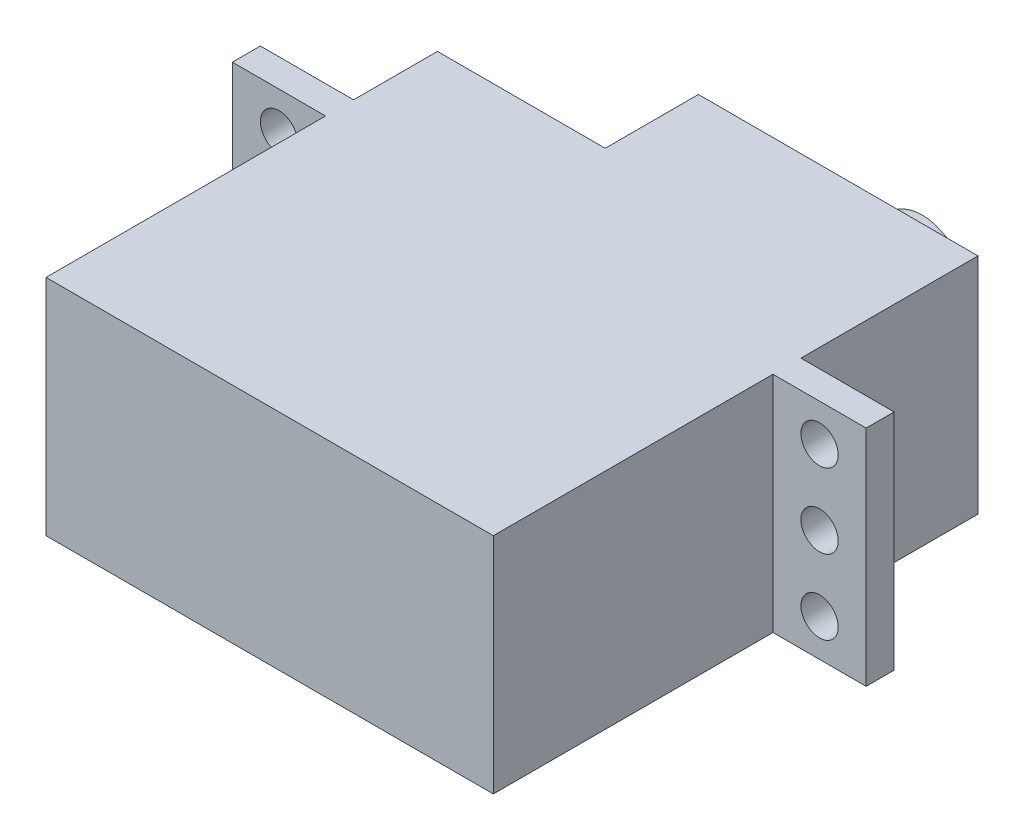
ISO-10303-21;
HEADER;
FILE_DESCRIPTION(('STEP AP214'),'2;1');
FILE_NAME('part.step','',(''),(''),'','','');
FILE_SCHEMA(('AUTOMOTIVE_DESIGN { 1 0 10303 214 1 1 1 1 }'));
ENDSEC;
DATA;
#1=APPLICATION_CONTEXT('core data for automotive mechanical design processes');
#2=APPLICATION_PROTOCOL_DEFINITION('international standard','automotive_design',2000,#1);
#3=PRODUCT_CONTEXT('',#1,'mechanical');
#4=PRODUCT('Part','Part','',(#3));
#5=PRODUCT_RELATED_PRODUCT_CATEGORY('part','',(#4));
#6=PRODUCT_DEFINITION_FORMATION('','',#4);
#7=PRODUCT_DEFINITION_CONTEXT('part definition',#1,'design');
#8=PRODUCT_DEFINITION('design','',#6,#7);
#9=PRODUCT_DEFINITION_SHAPE('','',#8);
#10=(LENGTH_UNIT() NAMED_UNIT(*) SI_UNIT(.MILLI.,.METRE.));
#11=(NAMED_UNIT(*) PLANE_ANGLE_UNIT() SI_UNIT($,.RADIAN.));
#12=(NAMED_UNIT(*) SI_UNIT($,.STERADIAN.) SOLID_ANGLE_UNIT());
#13=UNCERTAINTY_MEASURE_WITH_UNIT(LENGTH_MEASURE(1.E-05),#10,'distance_accuracy_value','');
#14=(GEOMETRIC_REPRESENTATION_CONTEXT(3) GLOBAL_UNCERTAINTY_ASSIGNED_CONTEXT((#13)) GLOBAL_UNIT_ASSIGNED_CONTEXT((#10,
#11,#12)) REPRESENTATION_CONTEXT('',''));
#15=CARTESIAN_POINT('',(0.,0.,0.));
#16=DIRECTION('',(0.,0.,1.));
#17=DIRECTION('',(1.,0.,0.));
#18=AXIS2_PLACEMENT_3D('',#15,#16,#17);
#19=CARTESIAN_POINT('',(0.,0.,-5.));
#20=DIRECTION('',(0.,0.,-1.));
#21=DIRECTION('',(-1.,0.,0.));
#22=AXIS2_PLACEMENT_3D('',#19,#20,#21);
#23=PLANE('',#22);
#24=DIRECTION('',(0.,-1.,0.));
#25=VECTOR('',#24,1.);
#26=CARTESIAN_POINT('',(24.,0.,-5.));
#27=LINE('',#26,#25);
#28=CARTESIAN_POINT('',(24.,0.,-5.));
#29=VERTEX_POINT('',#28);
#30=CARTESIAN_POINT('',(24.,-12.,-5.));
#31=VERTEX_POINT('',#30);
#32=EDGE_CURVE('E144',#29,#31,#27,.T.);
#33=ORIENTED_EDGE('',*,*,#32,.T.);
#34=DIRECTION('',(-1.,0.,0.));
#35=VECTOR('',#34,1.);
#36=CARTESIAN_POINT('',(24.,-12.,-5.));
#37=LINE('',#36,#35);
#38=CARTESIAN_POINT('',(9.,-12.,-5.));
#39=VERTEX_POINT('',#38);
#40=EDGE_CURVE('E151',#31,#39,#37,.T.);
#41=ORIENTED_EDGE('',*,*,#40,.T.);
#42=DIRECTION('',(0.,1.,0.));
#43=VECTOR('',#42,1.);
#44=CARTESIAN_POINT('',(9.,0.,-5.));
#45=LINE('',#44,#43);
#46=CARTESIAN_POINT('',(9.,0.,-5.));
#47=VERTEX_POINT('',#46);
#48=EDGE_CURVE('E157',#39,#47,#45,.T.);
#49=ORIENTED_EDGE('',*,*,#48,.T.);
#50=DIRECTION('',(1.,0.,0.));
#51=VECTOR('',#50,1.);
#52=CARTESIAN_POINT('',(24.,0.,-5.));
#53=LINE('',#52,#51);
#54=EDGE_CURVE('E162',#47,#29,#53,.T.);
#55=ORIENTED_EDGE('',*,*,#54,.T.);
#56=EDGE_LOOP('',(#33,#41,#49,#55));
#57=FACE_BOUND('',#56,.T.);
#58=CARTESIAN_POINT('',(17.,-6.,-5.));
#59=DIRECTION('',(0.,0.,-1.));
#60=DIRECTION('',(-1.,0.,0.));
#61=AXIS2_PLACEMENT_3D('',#58,#59,#60);
#62=CIRCLE('',#61,2.4);
#63=CARTESIAN_POINT('',(14.6,-6.,-5.));
#64=VERTEX_POINT('',#63);
#65=EDGE_CURVE('E167',#64,#64,#62,.T.);
#66=ORIENTED_EDGE('',*,*,#65,.F.);
#67=EDGE_LOOP('',(#66));
#68=FACE_BOUND('',#67,.T.);
#69=ADVANCED_FACE('F33',(#57,#68),#23,.T.);
#70=CARTESIAN_POINT('',(0.,0.,0.));
#71=DIRECTION('',(0.,0.,1.));
#72=DIRECTION('',(1.,0.,0.));
#73=AXIS2_PLACEMENT_3D('',#70,#71,#72);
#74=PLANE('',#73);
#75=DIRECTION('',(0.,1.,0.));
#76=VECTOR('',#75,1.);
#77=CARTESIAN_POINT('',(9.,0.,0.));
#78=LINE('',#77,#76);
#79=CARTESIAN_POINT('',(9.,-12.,0.));
#80=VERTEX_POINT('',#79);
#81=CARTESIAN_POINT('',(9.,0.,0.));
#82=VERTEX_POINT('',#81);
#83=EDGE_CURVE('E50',#80,#82,#78,.T.);
#84=ORIENTED_EDGE('',*,*,#83,.F.);
#85=DIRECTION('',(1.,0.,0.));
#86=VECTOR('',#85,1.);
#87=CARTESIAN_POINT('',(0.,-12.,0.));
#88=LINE('',#87,#86);
#89=CARTESIAN_POINT('',(0.,-12.,0.));
#90=VERTEX_POINT('',#89);
#91=EDGE_CURVE('E179',#90,#80,#88,.T.);
#92=ORIENTED_EDGE('',*,*,#91,.F.);
#93=DIRECTION('',(0.,-1.,0.));
#94=VECTOR('',#93,1.);
#95=CARTESIAN_POINT('',(0.,0.,0.));
#96=LINE('',#95,#94);
#97=CARTESIAN_POINT('',(0.,0.,0.));
#98=VERTEX_POINT('',#97);
#99=EDGE_CURVE('E264',#98,#90,#96,.T.);
#100=ORIENTED_EDGE('',*,*,#99,.F.);
#101=DIRECTION('',(-1.,0.,0.));
#102=VECTOR('',#101,1.);
#103=CARTESIAN_POINT('',(0.,0.,0.));
#104=LINE('',#103,#102);
#105=EDGE_CURVE('E269',#82,#98,#104,.T.);
#106=ORIENTED_EDGE('',*,*,#105,.F.);
#107=EDGE_LOOP('',(#84,#92,#100,#106));
#108=FACE_BOUND('',#107,.T.);
#109=ADVANCED_FACE('F301',(#108),#74,.F.);
#110=CARTESIAN_POINT('',(0.,0.,21.));
#111=DIRECTION('',(1.,0.,0.));
#112=DIRECTION('',(0.,1.,0.));
#113=AXIS2_PLACEMENT_3D('',#110,#111,#112);
#114=PLANE('',#113);
#115=DIRECTION('',(0.,-1.,0.));
#116=VECTOR('',#115,1.);
#117=CARTESIAN_POINT('',(0.,0.,4.5));
#118=LINE('',#117,#116);
#119=CARTESIAN_POINT('',(0.,0.,4.5));
#120=VERTEX_POINT('',#119);
#121=CARTESIAN_POINT('',(0.,-12.,4.5));
#122=VERTEX_POINT('',#121);
#123=EDGE_CURVE('E262',#120,#122,#118,.T.);
#124=ORIENTED_EDGE('',*,*,#123,.F.);
#125=DIRECTION('',(0.,0.,-1.));
#126=VECTOR('',#125,1.);
#127=CARTESIAN_POINT('',(0.,0.,21.));
#128=LINE('',#127,#126);
#129=EDGE_CURVE('E275',#120,#98,#128,.T.);
#130=ORIENTED_EDGE('',*,*,#129,.T.);
#131=ORIENTED_EDGE('',*,*,#99,.T.);
#132=DIRECTION('',(0.,0.,-1.));
#133=VECTOR('',#132,1.);
#134=CARTESIAN_POINT('',(0.,-12.,21.));
#135=LINE('',#134,#133);
#136=EDGE_CURVE('E42',#122,#90,#135,.T.);
#137=ORIENTED_EDGE('',*,*,#136,.F.);
#138=EDGE_LOOP('',(#124,#130,#131,#137));
#139=FACE_BOUND('',#138,.T.);
#140=ADVANCED_FACE('F299',(#139),#114,.F.);
#141=CARTESIAN_POINT('',(24.,0.,21.));
#142=DIRECTION('',(-1.,0.,0.));
#143=DIRECTION('',(0.,0.,1.));
#144=AXIS2_PLACEMENT_3D('',#141,#142,#143);
#145=PLANE('',#144);
#146=DIRECTION('',(0.,1.,0.));
#147=VECTOR('',#146,1.);
#148=CARTESIAN_POINT('',(24.,0.,4.5));
#149=LINE('',#148,#147);
#150=CARTESIAN_POINT('',(24.,-12.,4.5));
#151=VERTEX_POINT('',#150);
#152=CARTESIAN_POINT('',(24.,0.,4.5));
#153=VERTEX_POINT('',#152);
#154=EDGE_CURVE('E145',#151,#153,#149,.T.);
#155=ORIENTED_EDGE('',*,*,#154,.F.);
#156=DIRECTION('',(0.,0.,-1.));
#157=VECTOR('',#156,1.);
#158=CARTESIAN_POINT('',(24.,-12.,21.));
#159=LINE('',#158,#157);
#160=EDGE_CURVE('E139',#151,#31,#159,.T.);
#161=ORIENTED_EDGE('',*,*,#160,.T.);
#162=ORIENTED_EDGE('',*,*,#32,.F.);
#163=DIRECTION('',(0.,0.,-1.));
#164=VECTOR('',#163,1.);
#165=CARTESIAN_POINT('',(24.,0.,21.));
#166=LINE('',#165,#164);
#167=EDGE_CURVE('E285',#153,#29,#166,.T.);
#168=ORIENTED_EDGE('',*,*,#167,.F.);
#169=EDGE_LOOP('',(#155,#161,#162,#168));
#170=FACE_BOUND('',#169,.T.);
#171=ADVANCED_FACE('F141',(#170),#145,.F.);
#172=CARTESIAN_POINT('',(0.,0.,21.));
#173=VERTEX_POINT('',#172);
#174=CARTESIAN_POINT('',(0.,0.,6.));
#175=VERTEX_POINT('',#174);
#176=EDGE_CURVE('E281',#173,#175,#128,.T.);
#177=ORIENTED_EDGE('',*,*,#176,.T.);
#178=DIRECTION('',(0.,-1.,0.));
#179=VECTOR('',#178,1.);
#180=CARTESIAN_POINT('',(0.,0.,6.));
#181=LINE('',#180,#179);
#182=CARTESIAN_POINT('',(0.,-12.,6.00000000000001));
#183=VERTEX_POINT('',#182);
#184=EDGE_CURVE('E259',#175,#183,#181,.T.);
#185=ORIENTED_EDGE('',*,*,#184,.T.);
#186=CARTESIAN_POINT('',(0.,-12.,21.));
#187=VERTEX_POINT('',#186);
#188=EDGE_CURVE('E11',#187,#183,#135,.T.);
#189=ORIENTED_EDGE('',*,*,#188,.F.);
#190=DIRECTION('',(0.,-1.,0.));
#191=VECTOR('',#190,1.);
#192=CARTESIAN_POINT('',(0.,0.,21.));
#193=LINE('',#192,#191);
#194=EDGE_CURVE('E265',#173,#187,#193,.T.);
#195=ORIENTED_EDGE('',*,*,#194,.F.);
#196=EDGE_LOOP('',(#177,#185,#189,#195));
#197=FACE_BOUND('',#196,.T.);
#198=ADVANCED_FACE('F35',(#197),#114,.F.);
#199=CARTESIAN_POINT('',(0.,-12.,21.));
#200=DIRECTION('',(0.,1.,0.));
#201=DIRECTION('',(0.,0.,1.));
#202=AXIS2_PLACEMENT_3D('',#199,#200,#201);
#203=PLANE('',#202);
#204=ORIENTED_EDGE('',*,*,#188,.T.);
#205=DIRECTION('',(1.,0.,0.));
#206=VECTOR('',#205,1.);
#207=CARTESIAN_POINT('',(-5.,-12.,6.));
#208=LINE('',#207,#206);
#209=CARTESIAN_POINT('',(-5.,-12.,6.));
#210=VERTEX_POINT('',#209);
#211=EDGE_CURVE('E58',#210,#183,#208,.T.);
#212=ORIENTED_EDGE('',*,*,#211,.F.);
#213=DIRECTION('',(0.,0.,1.));
#214=VECTOR('',#213,1.);
#215=CARTESIAN_POINT('',(-5.,-12.,4.5));
#216=LINE('',#215,#214);
#217=CARTESIAN_POINT('',(-5.,-12.,4.5));
#218=VERTEX_POINT('',#217);
#219=EDGE_CURVE('E238',#218,#210,#216,.T.);
#220=ORIENTED_EDGE('',*,*,#219,.F.);
#221=DIRECTION('',(1.,0.,0.));
#222=VECTOR('',#221,1.);
#223=CARTESIAN_POINT('',(-5.,-12.,4.5));
#224=LINE('',#223,#222);
#225=EDGE_CURVE('E228',#218,#122,#224,.T.);
#226=ORIENTED_EDGE('',*,*,#225,.T.);
#227=ORIENTED_EDGE('',*,*,#136,.T.);
#228=ORIENTED_EDGE('',*,*,#91,.T.);
#229=DIRECTION('',(0.,0.,1.));
#230=VECTOR('',#229,1.);
#231=CARTESIAN_POINT('',(9.,-12.,-5.));
#232=LINE('',#231,#230);
#233=EDGE_CURVE('E154',#39,#80,#232,.T.);
#234=ORIENTED_EDGE('',*,*,#233,.F.);
#235=ORIENTED_EDGE('',*,*,#40,.F.);
#236=ORIENTED_EDGE('',*,*,#160,.F.);
#237=CARTESIAN_POINT('',(29.,-12.,4.5));
#238=VERTEX_POINT('',#237);
#239=EDGE_CURVE('E226',#151,#238,#224,.T.);
#240=ORIENTED_EDGE('',*,*,#239,.T.);
#241=DIRECTION('',(0.,0.,1.));
#242=VECTOR('',#241,1.);
#243=CARTESIAN_POINT('',(29.,-12.,4.5));
#244=LINE('',#243,#242);
#245=CARTESIAN_POINT('',(29.,-12.,6.));
#246=VERTEX_POINT('',#245);
#247=EDGE_CURVE('E253',#238,#246,#244,.T.);
#248=ORIENTED_EDGE('',*,*,#247,.T.);
#249=CARTESIAN_POINT('',(24.,-12.,6.));
#250=VERTEX_POINT('',#249);
#251=EDGE_CURVE('E240',#250,#246,#208,.T.);
#252=ORIENTED_EDGE('',*,*,#251,.F.);
#253=CARTESIAN_POINT('',(24.,-12.,21.));
#254=VERTEX_POINT('',#253);
#255=EDGE_CURVE('E147',#254,#250,#159,.T.);
#256=ORIENTED_EDGE('',*,*,#255,.F.);
#257=DIRECTION('',(1.,0.,0.));
#258=VECTOR('',#257,1.);
#259=CARTESIAN_POINT('',(0.,-12.,21.));
#260=LINE('',#259,#258);
#261=EDGE_CURVE('E268',#187,#254,#260,.T.);
#262=ORIENTED_EDGE('',*,*,#261,.F.);
#263=EDGE_LOOP('',(#204,#212,#220,#226,#227,#228,#234,#235,#236,#240,#248,#252,#256,#262));
#264=FACE_BOUND('',#263,.T.);
#265=ADVANCED_FACE('F152',(#264),#203,.F.);
#266=ORIENTED_EDGE('',*,*,#255,.T.);
#267=DIRECTION('',(0.,1.,0.));
#268=VECTOR('',#267,1.);
#269=CARTESIAN_POINT('',(24.,0.,6.));
#270=LINE('',#269,#268);
#271=CARTESIAN_POINT('',(24.,0.,6.00000000000001));
#272=VERTEX_POINT('',#271);
#273=EDGE_CURVE('E250',#250,#272,#270,.T.);
#274=ORIENTED_EDGE('',*,*,#273,.T.);
#275=CARTESIAN_POINT('',(24.,0.,21.));
#276=VERTEX_POINT('',#275);
#277=EDGE_CURVE('E148',#276,#272,#166,.T.);
#278=ORIENTED_EDGE('',*,*,#277,.F.);
#279=DIRECTION('',(0.,1.,0.));
#280=VECTOR('',#279,1.);
#281=CARTESIAN_POINT('',(24.,0.,21.));
#282=LINE('',#281,#280);
#283=EDGE_CURVE('E271',#254,#276,#282,.T.);
#284=ORIENTED_EDGE('',*,*,#283,.F.);
#285=EDGE_LOOP('',(#266,#274,#278,#284));
#286=FACE_BOUND('',#285,.T.);
#287=ADVANCED_FACE('F320',(#286),#145,.F.);
#288=CARTESIAN_POINT('',(0.,0.,21.));
#289=DIRECTION('',(0.,-1.,0.));
#290=DIRECTION('',(0.,0.,-1.));
#291=AXIS2_PLACEMENT_3D('',#288,#289,#290);
#292=PLANE('',#291);
#293=ORIENTED_EDGE('',*,*,#277,.T.);
#294=DIRECTION('',(-1.,0.,0.));
#295=VECTOR('',#294,1.);
#296=CARTESIAN_POINT('',(-5.,0.,6.));
#297=LINE('',#296,#295);
#298=CARTESIAN_POINT('',(29.,0.,6.));
#299=VERTEX_POINT('',#298);
#300=EDGE_CURVE('E227',#299,#272,#297,.T.);
#301=ORIENTED_EDGE('',*,*,#300,.F.);
#302=DIRECTION('',(0.,0.,1.));
#303=VECTOR('',#302,1.);
#304=CARTESIAN_POINT('',(29.,0.,4.5));
#305=LINE('',#304,#303);
#306=CARTESIAN_POINT('',(29.,0.,4.5));
#307=VERTEX_POINT('',#306);
#308=EDGE_CURVE('E251',#307,#299,#305,.T.);
#309=ORIENTED_EDGE('',*,*,#308,.F.);
#310=DIRECTION('',(-1.,0.,0.));
#311=VECTOR('',#310,1.);
#312=CARTESIAN_POINT('',(-5.,0.,4.5));
#313=LINE('',#312,#311);
#314=EDGE_CURVE('E235',#307,#153,#313,.T.);
#315=ORIENTED_EDGE('',*,*,#314,.T.);
#316=ORIENTED_EDGE('',*,*,#167,.T.);
#317=ORIENTED_EDGE('',*,*,#54,.F.);
#318=DIRECTION('',(0.,0.,1.));
#319=VECTOR('',#318,1.);
#320=CARTESIAN_POINT('',(9.,0.,-5.));
#321=LINE('',#320,#319);
#322=EDGE_CURVE('E172',#47,#82,#321,.T.);
#323=ORIENTED_EDGE('',*,*,#322,.T.);
#324=ORIENTED_EDGE('',*,*,#105,.T.);
#325=ORIENTED_EDGE('',*,*,#129,.F.);
#326=CARTESIAN_POINT('',(-5.,0.,4.5));
#327=VERTEX_POINT('',#326);
#328=EDGE_CURVE('E234',#120,#327,#313,.T.);
#329=ORIENTED_EDGE('',*,*,#328,.T.);
#330=DIRECTION('',(0.,0.,1.));
#331=VECTOR('',#330,1.);
#332=CARTESIAN_POINT('',(-5.,0.,4.5));
#333=LINE('',#332,#331);
#334=CARTESIAN_POINT('',(-5.,0.,6.));
#335=VERTEX_POINT('',#334);
#336=EDGE_CURVE('E247',#327,#335,#333,.T.);
#337=ORIENTED_EDGE('',*,*,#336,.T.);
#338=EDGE_CURVE('E245',#175,#335,#297,.T.);
#339=ORIENTED_EDGE('',*,*,#338,.F.);
#340=ORIENTED_EDGE('',*,*,#176,.F.);
#341=DIRECTION('',(-1.,0.,0.));
#342=VECTOR('',#341,1.);
#343=CARTESIAN_POINT('',(0.,0.,21.));
#344=LINE('',#343,#342);
#345=EDGE_CURVE('E273',#276,#173,#344,.T.);
#346=ORIENTED_EDGE('',*,*,#345,.F.);
#347=EDGE_LOOP('',(#293,#301,#309,#315,#316,#317,#323,#324,#325,#329,#337,#339,#340,#346));
#348=FACE_BOUND('',#347,.T.);
#349=ADVANCED_FACE('F311',(#348),#292,.F.);
#350=CARTESIAN_POINT('',(0.,0.,21.));
#351=DIRECTION('',(0.,0.,1.));
#352=DIRECTION('',(1.,0.,0.));
#353=AXIS2_PLACEMENT_3D('',#350,#351,#352);
#354=PLANE('',#353);
#355=ORIENTED_EDGE('',*,*,#194,.T.);
#356=ORIENTED_EDGE('',*,*,#261,.T.);
#357=ORIENTED_EDGE('',*,*,#283,.T.);
#358=ORIENTED_EDGE('',*,*,#345,.T.);
#359=EDGE_LOOP('',(#355,#356,#357,#358));
#360=FACE_BOUND('',#359,.T.);
#361=ADVANCED_FACE('F318',(#360),#354,.T.);
#362=CARTESIAN_POINT('',(29.,0.,4.5));
#363=DIRECTION('',(1.,0.,0.));
#364=DIRECTION('',(0.,1.,0.));
#365=AXIS2_PLACEMENT_3D('',#362,#363,#364);
#366=PLANE('',#365);
#367=DIRECTION('',(0.,1.,0.));
#368=VECTOR('',#367,1.);
#369=CARTESIAN_POINT('',(29.,0.,6.));
#370=LINE('',#369,#368);
#371=EDGE_CURVE('E242',#246,#299,#370,.T.);
#372=ORIENTED_EDGE('',*,*,#371,.F.);
#373=ORIENTED_EDGE('',*,*,#247,.F.);
#374=DIRECTION('',(0.,1.,0.));
#375=VECTOR('',#374,1.);
#376=CARTESIAN_POINT('',(29.,0.,4.5));
#377=LINE('',#376,#375);
#378=EDGE_CURVE('E231',#238,#307,#377,.T.);
#379=ORIENTED_EDGE('',*,*,#378,.T.);
#380=ORIENTED_EDGE('',*,*,#308,.T.);
#381=EDGE_LOOP('',(#372,#373,#379,#380));
#382=FACE_BOUND('',#381,.T.);
#383=ADVANCED_FACE('F327',(#382),#366,.T.);
#384=CARTESIAN_POINT('',(26.5000000000001,-10.,4.5));
#385=DIRECTION('',(0.,0.,1.));
#386=DIRECTION('',(1.,0.,0.));
#387=AXIS2_PLACEMENT_3D('',#384,#385,#386);
#388=CYLINDRICAL_SURFACE('',#387,0.999999999999998);
#389=CARTESIAN_POINT('',(26.5000000000001,-10.,4.5));
#390=DIRECTION('',(0.,0.,1.));
#391=DIRECTION('',(1.,0.,0.));
#392=AXIS2_PLACEMENT_3D('',#389,#390,#391);
#393=CIRCLE('',#392,0.999999999999998);
#394=CARTESIAN_POINT('',(27.5000000000001,-10.,4.5));
#395=VERTEX_POINT('',#394);
#396=EDGE_CURVE('E199',#395,#395,#393,.T.);
#397=ORIENTED_EDGE('',*,*,#396,.F.);
#398=EDGE_LOOP('',(#397));
#399=FACE_BOUND('',#398,.T.);
#400=CARTESIAN_POINT('',(26.5000000000001,-10.,6.));
#401=DIRECTION('',(0.,0.,1.));
#402=DIRECTION('',(1.,0.,0.));
#403=AXIS2_PLACEMENT_3D('',#400,#401,#402);
#404=CIRCLE('',#403,0.999999999999998);
#405=CARTESIAN_POINT('',(27.5000000000001,-10.,6.));
#406=VERTEX_POINT('',#405);
#407=EDGE_CURVE('E196',#406,#406,#404,.T.);
#408=ORIENTED_EDGE('',*,*,#407,.T.);
#409=EDGE_LOOP('',(#408));
#410=FACE_BOUND('',#409,.T.);
#411=ADVANCED_FACE('F366',(#399,#410),#388,.F.);
#412=CARTESIAN_POINT('',(26.5,-6.,4.5));
#413=DIRECTION('',(0.,0.,1.));
#414=DIRECTION('',(1.,0.,0.));
#415=AXIS2_PLACEMENT_3D('',#412,#413,#414);
#416=CYLINDRICAL_SURFACE('',#415,0.999999999999998);
#417=CARTESIAN_POINT('',(26.5,-6.,4.5));
#418=DIRECTION('',(0.,0.,1.));
#419=DIRECTION('',(1.,0.,0.));
#420=AXIS2_PLACEMENT_3D('',#417,#418,#419);
#421=CIRCLE('',#420,0.999999999999998);
#422=CARTESIAN_POINT('',(27.5,-6.,4.5));
#423=VERTEX_POINT('',#422);
#424=EDGE_CURVE('E205',#423,#423,#421,.T.);
#425=ORIENTED_EDGE('',*,*,#424,.F.);
#426=EDGE_LOOP('',(#425));
#427=FACE_BOUND('',#426,.T.);
#428=CARTESIAN_POINT('',(26.5,-6.,6.));
#429=DIRECTION('',(0.,0.,1.));
#430=DIRECTION('',(1.,0.,0.));
#431=AXIS2_PLACEMENT_3D('',#428,#429,#430);
#432=CIRCLE('',#431,0.999999999999998);
#433=CARTESIAN_POINT('',(27.5,-6.,6.));
#434=VERTEX_POINT('',#433);
#435=EDGE_CURVE('E202',#434,#434,#432,.T.);
#436=ORIENTED_EDGE('',*,*,#435,.T.);
#437=EDGE_LOOP('',(#436));
#438=FACE_BOUND('',#437,.T.);
#439=ADVANCED_FACE('F369',(#427,#438),#416,.F.);
#440=CARTESIAN_POINT('',(26.5,-2.,4.5));
#441=DIRECTION('',(0.,0.,1.));
#442=DIRECTION('',(1.,0.,0.));
#443=AXIS2_PLACEMENT_3D('',#440,#441,#442);
#444=CYLINDRICAL_SURFACE('',#443,0.999999999999998);
#445=CARTESIAN_POINT('',(26.5,-2.,4.5));
#446=DIRECTION('',(0.,0.,1.));
#447=DIRECTION('',(1.,0.,0.));
#448=AXIS2_PLACEMENT_3D('',#445,#446,#447);
#449=CIRCLE('',#448,0.999999999999998);
#450=CARTESIAN_POINT('',(27.5,-2.,4.5));
#451=VERTEX_POINT('',#450);
#452=EDGE_CURVE('E211',#451,#451,#449,.T.);
#453=ORIENTED_EDGE('',*,*,#452,.F.);
#454=EDGE_LOOP('',(#453));
#455=FACE_BOUND('',#454,.T.);
#456=CARTESIAN_POINT('',(26.5,-2.,6.));
#457=DIRECTION('',(0.,0.,1.));
#458=DIRECTION('',(1.,0.,0.));
#459=AXIS2_PLACEMENT_3D('',#456,#457,#458);
#460=CIRCLE('',#459,0.999999999999998);
#461=CARTESIAN_POINT('',(27.5,-2.,6.));
#462=VERTEX_POINT('',#461);
#463=EDGE_CURVE('E208',#462,#462,#460,.T.);
#464=ORIENTED_EDGE('',*,*,#463,.T.);
#465=EDGE_LOOP('',(#464));
#466=FACE_BOUND('',#465,.T.);
#467=ADVANCED_FACE('F339',(#455,#466),#444,.F.);
#468=CARTESIAN_POINT('',(0.,0.,6.));
#469=DIRECTION('',(0.,0.,1.));
#470=DIRECTION('',(1.,0.,0.));
#471=AXIS2_PLACEMENT_3D('',#468,#469,#470);
#472=PLANE('',#471);
#473=ORIENTED_EDGE('',*,*,#463,.F.);
#474=EDGE_LOOP('',(#473));
#475=FACE_BOUND('',#474,.T.);
#476=ORIENTED_EDGE('',*,*,#435,.F.);
#477=EDGE_LOOP('',(#476));
#478=FACE_BOUND('',#477,.T.);
#479=ORIENTED_EDGE('',*,*,#407,.F.);
#480=EDGE_LOOP('',(#479));
#481=FACE_BOUND('',#480,.T.);
#482=ORIENTED_EDGE('',*,*,#273,.F.);
#483=ORIENTED_EDGE('',*,*,#251,.T.);
#484=ORIENTED_EDGE('',*,*,#371,.T.);
#485=ORIENTED_EDGE('',*,*,#300,.T.);
#486=EDGE_LOOP('',(#482,#483,#484,#485));
#487=FACE_BOUND('',#486,.T.);
#488=ADVANCED_FACE('F322',(#475,#478,#481,#487),#472,.T.);
#489=CARTESIAN_POINT('',(0.,0.,4.5));
#490=DIRECTION('',(0.,0.,1.));
#491=DIRECTION('',(1.,0.,0.));
#492=AXIS2_PLACEMENT_3D('',#489,#490,#491);
#493=PLANE('',#492);
#494=ORIENTED_EDGE('',*,*,#452,.T.);
#495=EDGE_LOOP('',(#494));
#496=FACE_BOUND('',#495,.T.);
#497=ORIENTED_EDGE('',*,*,#424,.T.);
#498=EDGE_LOOP('',(#497));
#499=FACE_BOUND('',#498,.T.);
#500=ORIENTED_EDGE('',*,*,#396,.T.);
#501=EDGE_LOOP('',(#500));
#502=FACE_BOUND('',#501,.T.);
#503=ORIENTED_EDGE('',*,*,#239,.F.);
#504=ORIENTED_EDGE('',*,*,#154,.T.);
#505=ORIENTED_EDGE('',*,*,#314,.F.);
#506=ORIENTED_EDGE('',*,*,#378,.F.);
#507=EDGE_LOOP('',(#503,#504,#505,#506));
#508=FACE_BOUND('',#507,.T.);
#509=ADVANCED_FACE('F330',(#496,#499,#502,#508),#493,.F.);
#510=CARTESIAN_POINT('',(-2.5,-2.,4.5));
#511=DIRECTION('',(0.,0.,1.));
#512=DIRECTION('',(1.,0.,0.));
#513=AXIS2_PLACEMENT_3D('',#510,#511,#512);
#514=CIRCLE('',#513,1.);
#515=CARTESIAN_POINT('',(-1.5,-2.,4.5));
#516=VERTEX_POINT('',#515);
#517=EDGE_CURVE('E217',#516,#516,#514,.T.);
#518=ORIENTED_EDGE('',*,*,#517,.T.);
#519=EDGE_LOOP('',(#518));
#520=FACE_BOUND('',#519,.T.);
#521=CARTESIAN_POINT('',(-2.49999999999996,-6.,4.5));
#522=DIRECTION('',(0.,0.,1.));
#523=DIRECTION('',(1.,0.,0.));
#524=AXIS2_PLACEMENT_3D('',#521,#522,#523);
#525=CIRCLE('',#524,1.);
#526=CARTESIAN_POINT('',(-1.49999999999996,-6.,4.5));
#527=VERTEX_POINT('',#526);
#528=EDGE_CURVE('E193',#527,#527,#525,.T.);
#529=ORIENTED_EDGE('',*,*,#528,.T.);
#530=EDGE_LOOP('',(#529));
#531=FACE_BOUND('',#530,.T.);
#532=CARTESIAN_POINT('',(-2.49999999999992,-10.,4.5));
#533=DIRECTION('',(0.,0.,1.));
#534=DIRECTION('',(1.,0.,0.));
#535=AXIS2_PLACEMENT_3D('',#532,#533,#534);
#536=CIRCLE('',#535,1.);
#537=CARTESIAN_POINT('',(-1.49999999999992,-10.,4.5));
#538=VERTEX_POINT('',#537);
#539=EDGE_CURVE('E175',#538,#538,#536,.T.);
#540=ORIENTED_EDGE('',*,*,#539,.T.);
#541=EDGE_LOOP('',(#540));
#542=FACE_BOUND('',#541,.T.);
#543=ORIENTED_EDGE('',*,*,#328,.F.);
#544=ORIENTED_EDGE('',*,*,#123,.T.);
#545=ORIENTED_EDGE('',*,*,#225,.F.);
#546=DIRECTION('',(0.,-1.,0.));
#547=VECTOR('',#546,1.);
#548=CARTESIAN_POINT('',(-5.,0.,4.5));
#549=LINE('',#548,#547);
#550=EDGE_CURVE('E223',#327,#218,#549,.T.);
#551=ORIENTED_EDGE('',*,*,#550,.F.);
#552=EDGE_LOOP('',(#543,#544,#545,#551));
#553=FACE_BOUND('',#552,.T.);
#554=ADVANCED_FACE('F305',(#520,#531,#542,#553),#493,.F.);
#555=CARTESIAN_POINT('',(-2.5,-2.,6.));
#556=DIRECTION('',(0.,0.,1.));
#557=DIRECTION('',(1.,0.,0.));
#558=AXIS2_PLACEMENT_3D('',#555,#556,#557);
#559=CIRCLE('',#558,1.);
#560=CARTESIAN_POINT('',(-1.5,-2.,6.));
#561=VERTEX_POINT('',#560);
#562=EDGE_CURVE('E214',#561,#561,#559,.T.);
#563=ORIENTED_EDGE('',*,*,#562,.F.);
#564=EDGE_LOOP('',(#563));
#565=FACE_BOUND('',#564,.T.);
#566=CARTESIAN_POINT('',(-2.49999999999996,-6.,6.));
#567=DIRECTION('',(0.,0.,1.));
#568=DIRECTION('',(1.,0.,0.));
#569=AXIS2_PLACEMENT_3D('',#566,#567,#568);
#570=CIRCLE('',#569,1.);
#571=CARTESIAN_POINT('',(-1.49999999999996,-6.,6.));
#572=VERTEX_POINT('',#571);
#573=EDGE_CURVE('E191',#572,#572,#570,.T.);
#574=ORIENTED_EDGE('',*,*,#573,.F.);
#575=EDGE_LOOP('',(#574));
#576=FACE_BOUND('',#575,.T.);
#577=CARTESIAN_POINT('',(-2.49999999999992,-10.,6.));
#578=DIRECTION('',(0.,0.,1.));
#579=DIRECTION('',(1.,0.,0.));
#580=AXIS2_PLACEMENT_3D('',#577,#578,#579);
#581=CIRCLE('',#580,1.);
#582=CARTESIAN_POINT('',(-1.49999999999992,-10.,6.));
#583=VERTEX_POINT('',#582);
#584=EDGE_CURVE('E185',#583,#583,#581,.T.);
#585=ORIENTED_EDGE('',*,*,#584,.F.);
#586=EDGE_LOOP('',(#585));
#587=FACE_BOUND('',#586,.T.);
#588=ORIENTED_EDGE('',*,*,#184,.F.);
#589=ORIENTED_EDGE('',*,*,#338,.T.);
#590=DIRECTION('',(0.,-1.,0.));
#591=VECTOR('',#590,1.);
#592=CARTESIAN_POINT('',(-5.,0.,6.));
#593=LINE('',#592,#591);
#594=EDGE_CURVE('E220',#335,#210,#593,.T.);
#595=ORIENTED_EDGE('',*,*,#594,.T.);
#596=ORIENTED_EDGE('',*,*,#211,.T.);
#597=EDGE_LOOP('',(#588,#589,#595,#596));
#598=FACE_BOUND('',#597,.T.);
#599=ADVANCED_FACE('F312',(#565,#576,#587,#598),#472,.T.);
#600=CARTESIAN_POINT('',(-5.,0.,4.5));
#601=DIRECTION('',(-1.,0.,0.));
#602=DIRECTION('',(0.,-1.,0.));
#603=AXIS2_PLACEMENT_3D('',#600,#601,#602);
#604=PLANE('',#603);
#605=ORIENTED_EDGE('',*,*,#594,.F.);
#606=ORIENTED_EDGE('',*,*,#336,.F.);
#607=ORIENTED_EDGE('',*,*,#550,.T.);
#608=ORIENTED_EDGE('',*,*,#219,.T.);
#609=EDGE_LOOP('',(#605,#606,#607,#608));
#610=FACE_BOUND('',#609,.T.);
#611=ADVANCED_FACE('F309',(#610),#604,.T.);
#612=CARTESIAN_POINT('',(-2.5,-2.,4.5));
#613=DIRECTION('',(0.,0.,1.));
#614=DIRECTION('',(1.,0.,0.));
#615=AXIS2_PLACEMENT_3D('',#612,#613,#614);
#616=CYLINDRICAL_SURFACE('',#615,1.);
#617=ORIENTED_EDGE('',*,*,#517,.F.);
#618=EDGE_LOOP('',(#617));
#619=FACE_BOUND('',#618,.T.);
#620=ORIENTED_EDGE('',*,*,#562,.T.);
#621=EDGE_LOOP('',(#620));
#622=FACE_BOUND('',#621,.T.);
#623=ADVANCED_FACE('F364',(#619,#622),#616,.F.);
#624=CARTESIAN_POINT('',(-2.49999999999996,-6.,4.5));
#625=DIRECTION('',(0.,0.,1.));
#626=DIRECTION('',(1.,0.,0.));
#627=AXIS2_PLACEMENT_3D('',#624,#625,#626);
#628=CYLINDRICAL_SURFACE('',#627,1.);
#629=ORIENTED_EDGE('',*,*,#528,.F.);
#630=EDGE_LOOP('',(#629));
#631=FACE_BOUND('',#630,.T.);
#632=ORIENTED_EDGE('',*,*,#573,.T.);
#633=EDGE_LOOP('',(#632));
#634=FACE_BOUND('',#633,.T.);
#635=ADVANCED_FACE('F360',(#631,#634),#628,.F.);
#636=CARTESIAN_POINT('',(-2.49999999999992,-10.,4.5));
#637=DIRECTION('',(0.,0.,1.));
#638=DIRECTION('',(1.,0.,0.));
#639=AXIS2_PLACEMENT_3D('',#636,#637,#638);
#640=CYLINDRICAL_SURFACE('',#639,1.);
#641=ORIENTED_EDGE('',*,*,#539,.F.);
#642=EDGE_LOOP('',(#641));
#643=FACE_BOUND('',#642,.T.);
#644=ORIENTED_EDGE('',*,*,#584,.T.);
#645=EDGE_LOOP('',(#644));
#646=FACE_BOUND('',#645,.T.);
#647=ADVANCED_FACE('F357',(#643,#646),#640,.F.);
#648=CARTESIAN_POINT('',(9.,0.,-5.));
#649=DIRECTION('',(1.,0.,0.));
#650=DIRECTION('',(0.,1.,0.));
#651=AXIS2_PLACEMENT_3D('',#648,#649,#650);
#652=PLANE('',#651);
#653=ORIENTED_EDGE('',*,*,#83,.T.);
#654=ORIENTED_EDGE('',*,*,#322,.F.);
#655=ORIENTED_EDGE('',*,*,#48,.F.);
#656=ORIENTED_EDGE('',*,*,#233,.T.);
#657=EDGE_LOOP('',(#653,#654,#655,#656));
#658=FACE_BOUND('',#657,.T.);
#659=ADVANCED_FACE('F354',(#658),#652,.F.);
#660=CARTESIAN_POINT('',(17.,-6.,-9.));
#661=DIRECTION('',(0.,0.,1.));
#662=DIRECTION('',(1.,0.,0.));
#663=AXIS2_PLACEMENT_3D('',#660,#661,#662);
#664=CYLINDRICAL_SURFACE('',#663,2.4);
#665=CARTESIAN_POINT('',(17.,-6.,-9.));
#666=DIRECTION('',(0.,0.,-1.));
#667=DIRECTION('',(-1.,0.,0.));
#668=AXIS2_PLACEMENT_3D('',#665,#666,#667);
#669=CIRCLE('',#668,2.4);
#670=CARTESIAN_POINT('',(14.6,-6.,-9.));
#671=VERTEX_POINT('',#670);
#672=EDGE_CURVE('E164',#671,#671,#669,.T.);
#673=ORIENTED_EDGE('',*,*,#672,.F.);
#674=EDGE_LOOP('',(#673));
#675=FACE_BOUND('',#674,.T.);
#676=ORIENTED_EDGE('',*,*,#65,.T.);
#677=EDGE_LOOP('',(#676));
#678=FACE_BOUND('',#677,.T.);
#679=ADVANCED_FACE('F352',(#675,#678),#664,.T.);
#680=CARTESIAN_POINT('',(17.,-6.,-9.));
#681=DIRECTION('',(0.,0.,-1.));
#682=DIRECTION('',(-1.,0.,0.));
#683=AXIS2_PLACEMENT_3D('',#680,#681,#682);
#684=PLANE('',#683);
#685=ORIENTED_EDGE('',*,*,#672,.T.);
#686=EDGE_LOOP('',(#685));
#687=FACE_BOUND('',#686,.T.);
#688=ADVANCED_FACE('F453',(#687),#684,.T.);
#689=CLOSED_SHELL('',(#69,#109,#140,#171,#198,#265,#287,#349,#361,#383,#411,#439,#467,#488,#509,
#554,#599,#611,#623,#635,#647,#659,#679,#688));
#690=MANIFOLD_SOLID_BREP('B2',#689);
#691=ADVANCED_BREP_SHAPE_REPRESENTATION('',(#18,#690),#14);
#692=SHAPE_DEFINITION_REPRESENTATION(#9,#691);
ENDSEC;
END-ISO-10303-21;
